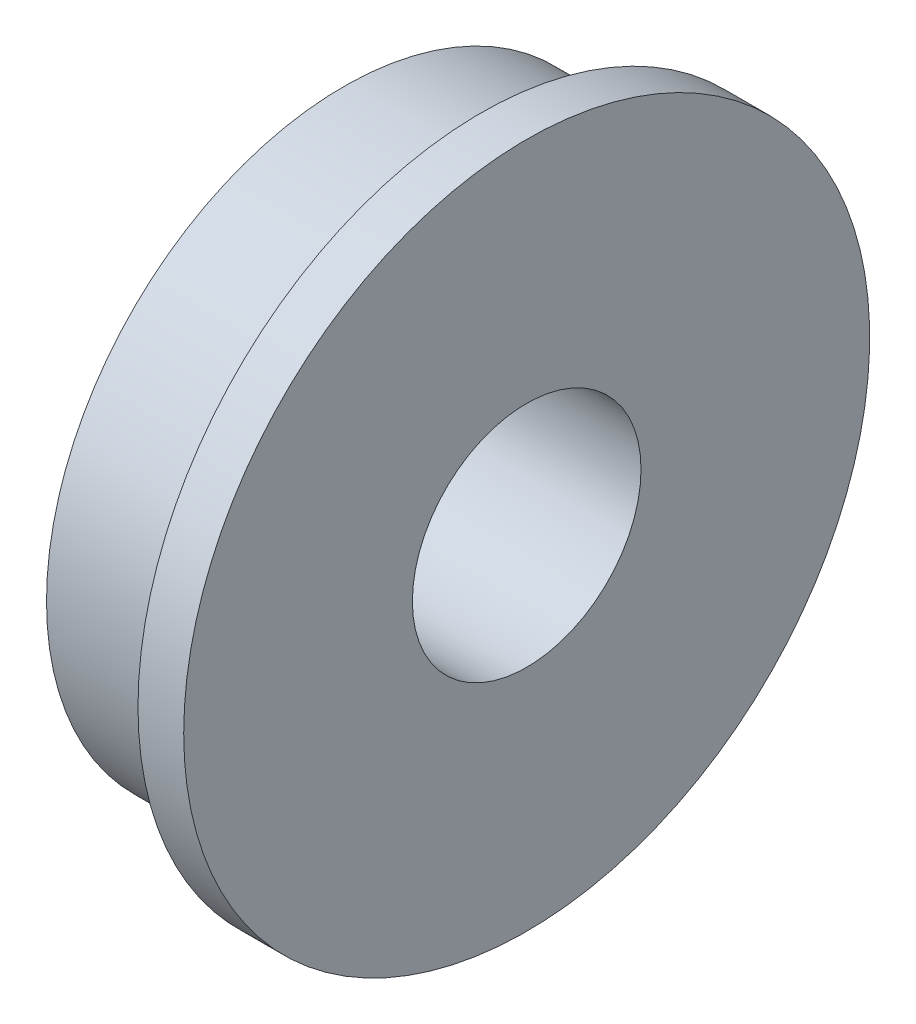
ISO-10303-21;
HEADER;
FILE_DESCRIPTION(('STEP AP214'),'2;1');
FILE_NAME('part.step','',(''),(''),'','','');
FILE_SCHEMA(('AUTOMOTIVE_DESIGN { 1 0 10303 214 1 1 1 1 }'));
ENDSEC;
DATA;
#1=APPLICATION_CONTEXT('core data for automotive mechanical design processes');
#2=APPLICATION_PROTOCOL_DEFINITION('international standard','automotive_design',2000,#1);
#3=PRODUCT_CONTEXT('',#1,'mechanical');
#4=PRODUCT('Part','Part','',(#3));
#5=PRODUCT_RELATED_PRODUCT_CATEGORY('part','',(#4));
#6=PRODUCT_DEFINITION_FORMATION('','',#4);
#7=PRODUCT_DEFINITION_CONTEXT('part definition',#1,'design');
#8=PRODUCT_DEFINITION('design','',#6,#7);
#9=PRODUCT_DEFINITION_SHAPE('','',#8);
#10=(LENGTH_UNIT() NAMED_UNIT(*) SI_UNIT(.MILLI.,.METRE.));
#11=(NAMED_UNIT(*) PLANE_ANGLE_UNIT() SI_UNIT($,.RADIAN.));
#12=(NAMED_UNIT(*) SI_UNIT($,.STERADIAN.) SOLID_ANGLE_UNIT());
#13=UNCERTAINTY_MEASURE_WITH_UNIT(LENGTH_MEASURE(1.E-05),#10,'distance_accuracy_value','');
#14=(GEOMETRIC_REPRESENTATION_CONTEXT(3) GLOBAL_UNCERTAINTY_ASSIGNED_CONTEXT((#13)) GLOBAL_UNIT_ASSIGNED_CONTEXT((#10,
#11,#12)) REPRESENTATION_CONTEXT('',''));
#15=CARTESIAN_POINT('',(0.,0.,0.));
#16=DIRECTION('',(0.,0.,1.));
#17=DIRECTION('',(1.,0.,0.));
#18=AXIS2_PLACEMENT_3D('',#15,#16,#17);
#19=CARTESIAN_POINT('',(0.,0.,0.));
#20=DIRECTION('',(-1.,0.,0.));
#21=DIRECTION('',(0.,0.,1.));
#22=AXIS2_PLACEMENT_3D('',#19,#20,#21);
#23=CYLINDRICAL_SURFACE('',#22,7.5);
#24=CARTESIAN_POINT('',(3.,0.,0.));
#25=DIRECTION('',(-1.,0.,0.));
#26=DIRECTION('',(0.,0.,1.));
#27=AXIS2_PLACEMENT_3D('',#24,#25,#26);
#28=CIRCLE('',#27,7.5);
#29=CARTESIAN_POINT('',(3.,0.,7.5));
#30=VERTEX_POINT('',#29);
#31=EDGE_CURVE('E10',#30,#30,#28,.T.);
#32=ORIENTED_EDGE('',*,*,#31,.F.);
#33=EDGE_LOOP('',(#32));
#34=FACE_BOUND('',#33,.T.);
#35=CARTESIAN_POINT('',(4.,0.,0.));
#36=DIRECTION('',(-1.,0.,0.));
#37=DIRECTION('',(0.,0.,1.));
#38=AXIS2_PLACEMENT_3D('',#35,#36,#37);
#39=CIRCLE('',#38,7.5);
#40=CARTESIAN_POINT('',(4.,0.,7.5));
#41=VERTEX_POINT('',#40);
#42=EDGE_CURVE('E54',#41,#41,#39,.T.);
#43=ORIENTED_EDGE('',*,*,#42,.T.);
#44=EDGE_LOOP('',(#43));
#45=FACE_BOUND('',#44,.T.);
#46=ADVANCED_FACE('F32',(#34,#45),#23,.T.);
#47=CARTESIAN_POINT('',(3.,0.,-7.5));
#48=DIRECTION('',(1.,0.,0.));
#49=DIRECTION('',(0.,0.,-1.));
#50=AXIS2_PLACEMENT_3D('',#47,#48,#49);
#51=PLANE('',#50);
#52=CARTESIAN_POINT('',(3.,0.,0.));
#53=DIRECTION('',(-1.,0.,0.));
#54=DIRECTION('',(0.,0.,1.));
#55=AXIS2_PLACEMENT_3D('',#52,#53,#54);
#56=CIRCLE('',#55,6.5);
#57=CARTESIAN_POINT('',(3.,0.,6.5));
#58=VERTEX_POINT('',#57);
#59=EDGE_CURVE('E38',#58,#58,#56,.T.);
#60=ORIENTED_EDGE('',*,*,#59,.F.);
#61=EDGE_LOOP('',(#60));
#62=FACE_BOUND('',#61,.T.);
#63=ORIENTED_EDGE('',*,*,#31,.T.);
#64=EDGE_LOOP('',(#63));
#65=FACE_BOUND('',#64,.T.);
#66=ADVANCED_FACE('F79',(#62,#65),#51,.F.);
#67=CARTESIAN_POINT('',(0.,0.,0.));
#68=DIRECTION('',(-1.,0.,0.));
#69=DIRECTION('',(0.,0.,1.));
#70=AXIS2_PLACEMENT_3D('',#67,#68,#69);
#71=CYLINDRICAL_SURFACE('',#70,6.5);
#72=CARTESIAN_POINT('',(0.,0.,0.));
#73=DIRECTION('',(-1.,0.,0.));
#74=DIRECTION('',(0.,0.,1.));
#75=AXIS2_PLACEMENT_3D('',#72,#73,#74);
#76=CIRCLE('',#75,6.5);
#77=CARTESIAN_POINT('',(0.,0.,6.5));
#78=VERTEX_POINT('',#77);
#79=EDGE_CURVE('E42',#78,#78,#76,.T.);
#80=ORIENTED_EDGE('',*,*,#79,.F.);
#81=EDGE_LOOP('',(#80));
#82=FACE_BOUND('',#81,.T.);
#83=ORIENTED_EDGE('',*,*,#59,.T.);
#84=EDGE_LOOP('',(#83));
#85=FACE_BOUND('',#84,.T.);
#86=ADVANCED_FACE('F74',(#82,#85),#71,.T.);
#87=CARTESIAN_POINT('',(0.,0.,-6.5));
#88=DIRECTION('',(1.,0.,0.));
#89=DIRECTION('',(0.,0.,-1.));
#90=AXIS2_PLACEMENT_3D('',#87,#88,#89);
#91=PLANE('',#90);
#92=CARTESIAN_POINT('',(0.,0.,0.));
#93=DIRECTION('',(-1.,0.,0.));
#94=DIRECTION('',(0.,0.,1.));
#95=AXIS2_PLACEMENT_3D('',#92,#93,#94);
#96=CIRCLE('',#95,2.5);
#97=CARTESIAN_POINT('',(0.,0.,2.5));
#98=VERTEX_POINT('',#97);
#99=EDGE_CURVE('E46',#98,#98,#96,.T.);
#100=ORIENTED_EDGE('',*,*,#99,.F.);
#101=EDGE_LOOP('',(#100));
#102=FACE_BOUND('',#101,.T.);
#103=ORIENTED_EDGE('',*,*,#79,.T.);
#104=EDGE_LOOP('',(#103));
#105=FACE_BOUND('',#104,.T.);
#106=ADVANCED_FACE('F68',(#102,#105),#91,.F.);
#107=CARTESIAN_POINT('',(0.,0.,0.));
#108=DIRECTION('',(-1.,0.,0.));
#109=DIRECTION('',(0.,0.,1.));
#110=AXIS2_PLACEMENT_3D('',#107,#108,#109);
#111=CYLINDRICAL_SURFACE('',#110,2.5);
#112=CARTESIAN_POINT('',(4.,0.,0.));
#113=DIRECTION('',(-1.,0.,0.));
#114=DIRECTION('',(0.,0.,1.));
#115=AXIS2_PLACEMENT_3D('',#112,#113,#114);
#116=CIRCLE('',#115,2.5);
#117=CARTESIAN_POINT('',(4.,0.,2.5));
#118=VERTEX_POINT('',#117);
#119=EDGE_CURVE('E51',#118,#118,#116,.T.);
#120=ORIENTED_EDGE('',*,*,#119,.F.);
#121=EDGE_LOOP('',(#120));
#122=FACE_BOUND('',#121,.T.);
#123=ORIENTED_EDGE('',*,*,#99,.T.);
#124=EDGE_LOOP('',(#123));
#125=FACE_BOUND('',#124,.T.);
#126=ADVANCED_FACE('F62',(#122,#125),#111,.F.);
#127=CARTESIAN_POINT('',(4.,0.,-2.5));
#128=DIRECTION('',(-1.,0.,0.));
#129=DIRECTION('',(0.,0.,1.));
#130=AXIS2_PLACEMENT_3D('',#127,#128,#129);
#131=PLANE('',#130);
#132=ORIENTED_EDGE('',*,*,#42,.F.);
#133=EDGE_LOOP('',(#132));
#134=FACE_BOUND('',#133,.T.);
#135=ORIENTED_EDGE('',*,*,#119,.T.);
#136=EDGE_LOOP('',(#135));
#137=FACE_BOUND('',#136,.T.);
#138=ADVANCED_FACE('F59',(#134,#137),#131,.F.);
#139=CLOSED_SHELL('',(#46,#66,#86,#106,#126,#138));
#140=MANIFOLD_SOLID_BREP('B2',#139);
#141=ADVANCED_BREP_SHAPE_REPRESENTATION('',(#18,#140),#14);
#142=SHAPE_DEFINITION_REPRESENTATION(#9,#141);
ENDSEC;
END-ISO-10303-21;
